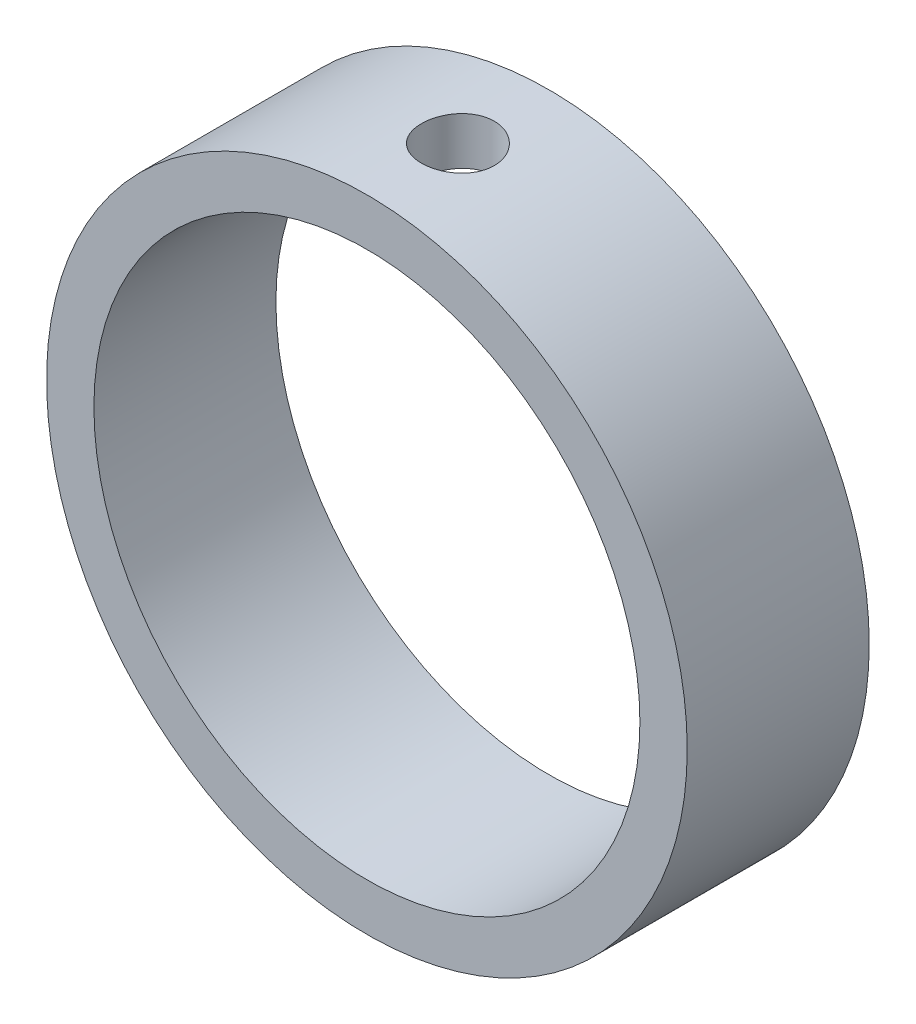
ISO-10303-21;
HEADER;
FILE_DESCRIPTION(('STEP AP214'),'2;1');
FILE_NAME('part.step','',(''),(''),'','','');
FILE_SCHEMA(('AUTOMOTIVE_DESIGN { 1 0 10303 214 1 1 1 1 }'));
ENDSEC;
DATA;
#1=APPLICATION_CONTEXT('core data for automotive mechanical design processes');
#2=APPLICATION_PROTOCOL_DEFINITION('international standard','automotive_design',2000,#1);
#3=PRODUCT_CONTEXT('',#1,'mechanical');
#4=PRODUCT('Part','Part','',(#3));
#5=PRODUCT_RELATED_PRODUCT_CATEGORY('part','',(#4));
#6=PRODUCT_DEFINITION_FORMATION('','',#4);
#7=PRODUCT_DEFINITION_CONTEXT('part definition',#1,'design');
#8=PRODUCT_DEFINITION('design','',#6,#7);
#9=PRODUCT_DEFINITION_SHAPE('','',#8);
#10=(LENGTH_UNIT() NAMED_UNIT(*) SI_UNIT(.MILLI.,.METRE.));
#11=(NAMED_UNIT(*) PLANE_ANGLE_UNIT() SI_UNIT($,.RADIAN.));
#12=(NAMED_UNIT(*) SI_UNIT($,.STERADIAN.) SOLID_ANGLE_UNIT());
#13=UNCERTAINTY_MEASURE_WITH_UNIT(LENGTH_MEASURE(1.E-05),#10,'distance_accuracy_value','');
#14=(GEOMETRIC_REPRESENTATION_CONTEXT(3) GLOBAL_UNCERTAINTY_ASSIGNED_CONTEXT((#13)) GLOBAL_UNIT_ASSIGNED_CONTEXT((#10,
#11,#12)) REPRESENTATION_CONTEXT('',''));
#15=CARTESIAN_POINT('',(0.,0.,0.));
#16=DIRECTION('',(0.,0.,1.));
#17=DIRECTION('',(1.,0.,0.));
#18=AXIS2_PLACEMENT_3D('',#15,#16,#17);
#19=CARTESIAN_POINT('',(0.,0.,25.));
#20=DIRECTION('',(0.,0.,-1.));
#21=DIRECTION('',(-1.,0.,0.));
#22=AXIS2_PLACEMENT_3D('',#19,#20,#21);
#23=CYLINDRICAL_SURFACE('',#22,44.);
#24=CARTESIAN_POINT('',(0.,0.,25.));
#25=DIRECTION('',(0.,0.,1.));
#26=DIRECTION('',(1.,0.,0.));
#27=AXIS2_PLACEMENT_3D('',#24,#25,#26);
#28=CIRCLE('',#27,44.);
#29=CARTESIAN_POINT('',(44.,0.,25.));
#30=VERTEX_POINT('',#29);
#31=EDGE_CURVE('E10',#30,#30,#28,.T.);
#32=ORIENTED_EDGE('',*,*,#31,.F.);
#33=EDGE_LOOP('',(#32));
#34=FACE_BOUND('',#33,.T.);
#35=CARTESIAN_POINT('',(0.,0.,0.));
#36=DIRECTION('',(0.,0.,1.));
#37=DIRECTION('',(1.,0.,0.));
#38=AXIS2_PLACEMENT_3D('',#35,#36,#37);
#39=CIRCLE('',#38,44.);
#40=CARTESIAN_POINT('',(44.,0.,0.));
#41=VERTEX_POINT('',#40);
#42=EDGE_CURVE('E44',#41,#41,#39,.T.);
#43=ORIENTED_EDGE('',*,*,#42,.T.);
#44=EDGE_LOOP('',(#43));
#45=FACE_BOUND('',#44,.T.);
#46=CARTESIAN_POINT('',(0.,44.,7.5));
#47=CARTESIAN_POINT('',(-0.13999141125662,44.0000004581266,7.49999850614793));
#48=CARTESIAN_POINT('',(-0.279960479471429,43.9993305682535,7.50588143545811));
#49=CARTESIAN_POINT('',(-0.558943697753561,43.9966707032609,7.52936870419389));
#50=CARTESIAN_POINT('',(-0.69795761767849,43.994680420536,7.54697577493643));
#51=CARTESIAN_POINT('',(-0.974097994966257,43.9894330890567,7.5938036654042));
#52=CARTESIAN_POINT('',(-1.11122291462584,43.9861750649085,7.6230334279487));
#53=CARTESIAN_POINT('',(-1.38255453793291,43.9784830315098,7.69290368403062));
#54=CARTESIAN_POINT('',(-1.51676015370132,43.974048591724,7.73354835542571));
#55=CARTESIAN_POINT('',(-1.78111605427153,43.9641343126888,7.82590014923754));
#56=CARTESIAN_POINT('',(-1.91127031016283,43.9586555371905,7.87759602145357));
#57=CARTESIAN_POINT('',(-2.16679914436993,43.9468013442121,7.99172221174183));
#58=CARTESIAN_POINT('',(-2.29217194168833,43.9404255966951,8.05415648285205));
#59=CARTESIAN_POINT('',(-2.53714233280952,43.9269615480419,8.18926178429677));
#60=CARTESIAN_POINT('',(-2.65674311924509,43.9198736476588,8.26192706642542));
#61=CARTESIAN_POINT('',(-2.8894567777011,43.9051778280313,8.41703533566126));
#62=CARTESIAN_POINT('',(-3.00256722707446,43.8975697169005,8.49948193906643));
#63=CARTESIAN_POINT('',(-3.22187590285528,43.8820196413832,8.67387714718923));
#64=CARTESIAN_POINT('',(-3.32804682933456,43.8740765395891,8.76585998271369));
#65=CARTESIAN_POINT('',(-3.53231046879683,43.8581039744426,8.95846150976974));
#66=CARTESIAN_POINT('',(-3.6304001804294,43.8500744802449,9.05908338174519));
#67=CARTESIAN_POINT('',(-3.81774090521255,43.8341612434348,9.26819645549704));
#68=CARTESIAN_POINT('',(-3.90699473084515,43.8262774550979,9.37668513407915));
#69=CARTESIAN_POINT('',(-4.07610263735484,43.8108730942795,9.60084391017931));
#70=CARTESIAN_POINT('',(-4.15595323797214,43.8033526568825,9.71651664256973));
#71=CARTESIAN_POINT('',(-4.30583015580509,43.7888742918897,9.95448514910312));
#72=CARTESIAN_POINT('',(-4.37583242097246,43.7819177584459,10.0767961604914));
#73=CARTESIAN_POINT('',(-4.50530495566809,43.768784117096,10.326966367124));
#74=CARTESIAN_POINT('',(-4.56477131067908,43.7626072991297,10.4548276026265));
#75=CARTESIAN_POINT('',(-4.67268674404324,43.7512165733361,10.7151112099878));
#76=CARTESIAN_POINT('',(-4.72114016038494,43.746002286521,10.8475317621851));
#77=CARTESIAN_POINT('',(-4.80671808573633,43.7366812412697,11.1160365709211));
#78=CARTESIAN_POINT('',(-4.84383842905211,43.7325748901413,11.2521221546616));
#79=CARTESIAN_POINT('',(-4.93742616118866,43.7221451764026,11.6631340934795));
#80=CARTESIAN_POINT('',(-4.97670993890178,43.7176467517109,11.942242539906));
#81=CARTESIAN_POINT('',(-5.00788886178928,43.7140853994659,12.5029721127435));
#82=CARTESIAN_POINT('',(-4.99978559368062,43.7150222899155,12.7845931547068));
#83=CARTESIAN_POINT('',(-4.93664828279359,43.7221967989103,13.3411439314998));
#84=CARTESIAN_POINT('',(-4.88183500734194,43.7284094817919,13.6160988956415));
#85=CARTESIAN_POINT('',(-4.72716103590393,43.7453991420421,14.1528711369955));
#86=CARTESIAN_POINT('',(-4.62729957288187,43.7561761971282,14.4146881904243));
#87=CARTESIAN_POINT('',(-4.38512792762072,43.781108146679,14.9184574270799));
#88=CARTESIAN_POINT('',(-4.24272081756643,43.7952707392153,15.160362624386));
#89=CARTESIAN_POINT('',(-3.91956858948055,43.8253719866508,15.6169232120794));
#90=CARTESIAN_POINT('',(-3.73882202150306,43.84131070871,15.8315775713863));
#91=CARTESIAN_POINT('',(-3.34289348478621,43.8732793302228,16.2288266651161));
#92=CARTESIAN_POINT('',(-3.12752099291229,43.8893092312201,16.411231564252));
#93=CARTESIAN_POINT('',(-2.66911282761631,43.9195686592559,16.7373288209149));
#94=CARTESIAN_POINT('',(-2.42607710778434,43.933798183274,16.8810211134934));
#95=CARTESIAN_POINT('',(-1.91910216520873,43.9588603102042,17.1256107257947));
#96=CARTESIAN_POINT('',(-1.65515768724329,43.9696920557017,17.2264972459268));
#97=CARTESIAN_POINT('',(-1.11392482077588,43.9867300070378,17.3824663852006));
#98=CARTESIAN_POINT('',(-0.836636948486711,43.9929363916638,17.4375507747741));
#99=CARTESIAN_POINT('',(-0.278231124816663,44.0000012325122,17.5001084860995));
#100=CARTESIAN_POINT('',(0.00285714890419533,44.0008890864601,17.5078435325244));
#101=CARTESIAN_POINT('',(0.562325951365314,43.997295940638,17.4761720956309));
#102=CARTESIAN_POINT('',(0.840706527482438,43.9928150349766,17.4367664386395));
#103=CARTESIAN_POINT('',(1.38609358678543,43.9790063712738,17.3121494905095));
#104=CARTESIAN_POINT('',(1.65312869699059,43.969691705935,17.22706191183));
#105=CARTESIAN_POINT('',(2.16913748960813,43.9472593400305,17.0136242747638));
#106=CARTESIAN_POINT('',(2.41811065710194,43.9341415310961,16.8852729835829));
#107=CARTESIAN_POINT('',(2.89210403028099,43.9054942929266,16.5883107575816));
#108=CARTESIAN_POINT('',(3.11701674246998,43.8899547457658,16.4195292412079));
#109=CARTESIAN_POINT('',(3.53541368185469,43.8582370845888,16.0467395357457));
#110=CARTESIAN_POINT('',(3.72889688408027,43.8420589497686,15.8427301982651));
#111=CARTESIAN_POINT('',(4.07986196811242,43.8107977446684,15.4041319675801));
#112=CARTESIAN_POINT('',(4.23717117756978,43.7957201519302,15.1694044694563));
#113=CARTESIAN_POINT('',(4.51013138976851,43.7684545879784,14.676696829135));
#114=CARTESIAN_POINT('',(4.62578310259632,43.7562665675108,14.4187170833851));
#115=CARTESIAN_POINT('',(4.81186644373251,43.7361946556692,13.8874546026046));
#116=CARTESIAN_POINT('',(4.88239800493097,43.7283012583321,13.6142071536856));
#117=CARTESIAN_POINT('',(4.97654257681038,43.7176894488162,13.0594984999998));
#118=CARTESIAN_POINT('',(5.00015736357087,43.714970840741,12.7780376065703));
#119=CARTESIAN_POINT('',(4.99992022972581,43.7149936939285,12.3569604613044));
#120=CARTESIAN_POINT('',(4.99395320659471,43.7156784234056,12.2171127214404));
#121=CARTESIAN_POINT('',(4.97032803322491,43.718371576306,11.9384351484297));
#122=CARTESIAN_POINT('',(4.95267423052156,43.7203795074908,11.7996049561612));
#123=CARTESIAN_POINT('',(4.90579167748809,43.7256647144177,11.5238957294153));
#124=CARTESIAN_POINT('',(4.87655870152535,43.7289424535459,11.3870174261617));
#125=CARTESIAN_POINT('',(4.80674789491028,43.7366712089749,11.1162700624496));
#126=CARTESIAN_POINT('',(4.76617420128519,43.7411217973932,10.9823999238342));
#127=CARTESIAN_POINT('',(4.67396649723871,43.7510706748011,10.7185481528664));
#128=CARTESIAN_POINT('',(4.62233118663799,43.7565690869433,10.5885669796705));
#129=CARTESIAN_POINT('',(4.50839603837614,43.7684548796131,10.333465346954));
#130=CARTESIAN_POINT('',(4.44610008405933,43.774841936277,10.2083431377538));
#131=CARTESIAN_POINT('',(4.31124998997299,43.7883285168175,9.96373601746295));
#132=CARTESIAN_POINT('',(4.23869215531546,43.7954282970485,9.84425315763163));
#133=CARTESIAN_POINT('',(4.08387551741959,43.8101358375255,9.61184322351456));
#134=CARTESIAN_POINT('',(4.00162022154341,43.8177434136834,9.49891380090968));
#135=CARTESIAN_POINT('',(3.82745182870047,43.8333012524322,9.27970118430513));
#136=CARTESIAN_POINT('',(3.73548483164834,43.8412532657138,9.17346093435833));
#137=CARTESIAN_POINT('',(3.54297708219709,43.8572301429132,8.96913487956808));
#138=CARTESIAN_POINT('',(3.4424394601815,43.8652549792838,8.87104612305895));
#139=CARTESIAN_POINT('',(3.23340074957693,43.8811589502823,8.68360919044055));
#140=CARTESIAN_POINT('',(3.12489487290866,43.8890379936848,8.59426634617263));
#141=CARTESIAN_POINT('',(2.90077341497056,43.9044203143742,8.42504936693634));
#142=CARTESIAN_POINT('',(2.78516047440591,43.9119237293719,8.34517174697528));
#143=CARTESIAN_POINT('',(2.54717424585691,43.9263720566147,8.19514701341109));
#144=CARTESIAN_POINT('',(2.42477840851766,43.9333148908783,8.12503546213163));
#145=CARTESIAN_POINT('',(2.17451550917749,43.9464125521565,7.99540962443344));
#146=CARTESIAN_POINT('',(2.04665047412735,43.9525676677902,7.9358914534717));
#147=CARTESIAN_POINT('',(1.78641495302468,43.9639132078741,7.82789669055715));
#148=CARTESIAN_POINT('',(1.6540481644111,43.9691044024174,7.77941127730199));
#149=CARTESIAN_POINT('',(1.38570276254002,43.9783794404877,7.69378892948106));
#150=CARTESIAN_POINT('',(1.2497250268082,43.9824635504009,7.65664926463384));
#151=CARTESIAN_POINT('',(0.93016971484192,43.9905439518324,7.58373147874333));
#152=CARTESIAN_POINT('',(0.745556586672629,43.994075509304,7.55236345232762));
#153=CARTESIAN_POINT('',(0.373949013766013,43.998803220807,7.51049877009299));
#154=CARTESIAN_POINT('',(0.186954582643699,43.9999993881849,7.50000199499731));
#155=CARTESIAN_POINT('',(0.,44.,7.5));
#156=B_SPLINE_CURVE_WITH_KNOTS('',3,(#46,#47,#48,#49,#50,#51,#52,#53,#54,#55,#56,#57,#58,#59,
#60,#61,#62,#63,#64,#65,#66,#67,#68,#69,#70,#71,#72,#73,#74,#75,#76,#77,#78,#79,#80,#81,#82,#83,
#84,#85,#86,#87,#88,#89,#90,#91,#92,#93,#94,#95,#96,#97,#98,#99,#100,#101,#102,#103,#104,#105,
#106,#107,#108,#109,#110,#111,#112,#113,#114,#115,#116,#117,#118,#119,#120,#121,#122,#123,#124,
#125,#126,#127,#128,#129,#130,#131,#132,#133,#134,#135,#136,#137,#138,#139,#140,#141,#142,#143,
#144,#145,#146,#147,#148,#149,#150,#151,#152,#153,#154,#155),.UNSPECIFIED.,.T.,.F.,(4,2,2,2,2,2,
2,2,2,2,2,2,2,2,2,2,2,2,2,2,2,2,2,2,2,2,2,2,2,2,2,2,2,2,2,2,2,2,2,2,2,2,2,2,2,2,2,2,2,2,2,2,2,2,
4),(0.,0.419810686635586,0.839719208784399,1.25995144724957,1.68033769164167,2.10029800066975,
2.5204132383973,2.94029337295465,3.36032922997954,3.78192876830819,4.20368418871408,
4.62530492886575,5.04708122930201,5.46987036425217,5.89281625457319,6.3155952569767,
6.73852947354387,7.57982110733377,8.42108457131419,9.25839385210692,10.0957173903072,
10.934963263568,11.7742408816211,12.6183053324352,13.4623711993358,14.3066498915821,
15.1508959476327,15.990471167584,16.8300316708795,17.6673299222118,18.5046520342741,
19.3455711736353,20.1865177313068,21.0313987717906,21.8762654098977,22.7192542843803,
23.5622112461016,23.9817329615592,24.4010987006563,24.8206176217275,25.2399837040446,
25.6593991056043,26.0786620509965,26.4980763421643,26.9173394029445,27.3390656147619,
27.7606384475126,28.1824667071435,28.6041391684096,29.0273090733754,29.4503234827753,
29.8729984708284,30.2955716645922,30.8562202039863,31.4168655393309),.UNSPECIFIED.);
#157=CARTESIAN_POINT('',(0.,44.,7.5));
#158=VERTEX_POINT('',#157);
#159=EDGE_CURVE('E54',#158,#158,#156,.T.);
#160=ORIENTED_EDGE('',*,*,#159,.F.);
#161=EDGE_LOOP('',(#160));
#162=FACE_BOUND('',#161,.T.);
#163=ADVANCED_FACE('F31',(#34,#45,#162),#23,.T.);
#164=CARTESIAN_POINT('',(0.,0.,25.));
#165=DIRECTION('',(0.,0.,-1.));
#166=DIRECTION('',(-1.,0.,0.));
#167=AXIS2_PLACEMENT_3D('',#164,#165,#166);
#168=CYLINDRICAL_SURFACE('',#167,37.5);
#169=CARTESIAN_POINT('',(0.,0.,0.));
#170=DIRECTION('',(0.,0.,1.));
#171=DIRECTION('',(1.,0.,0.));
#172=AXIS2_PLACEMENT_3D('',#169,#170,#171);
#173=CIRCLE('',#172,37.5);
#174=CARTESIAN_POINT('',(37.5,0.,0.));
#175=VERTEX_POINT('',#174);
#176=EDGE_CURVE('E51',#175,#175,#173,.T.);
#177=ORIENTED_EDGE('',*,*,#176,.F.);
#178=EDGE_LOOP('',(#177));
#179=FACE_BOUND('',#178,.T.);
#180=CARTESIAN_POINT('',(0.,0.,25.));
#181=DIRECTION('',(0.,0.,1.));
#182=DIRECTION('',(1.,0.,0.));
#183=AXIS2_PLACEMENT_3D('',#180,#181,#182);
#184=CIRCLE('',#183,37.5);
#185=CARTESIAN_POINT('',(37.5,0.,25.));
#186=VERTEX_POINT('',#185);
#187=EDGE_CURVE('E49',#186,#186,#184,.T.);
#188=ORIENTED_EDGE('',*,*,#187,.T.);
#189=EDGE_LOOP('',(#188));
#190=FACE_BOUND('',#189,.T.);
#191=CARTESIAN_POINT('',(0.,37.5,7.5));
#192=CARTESIAN_POINT('',(-0.139809857161942,37.5000006035784,7.49999830351591));
#193=CARTESIAN_POINT('',(-0.279595172641455,37.4992166043786,7.50586608529861));
#194=CARTESIAN_POINT('',(-0.558209611683407,37.4961038038827,7.5292915606585));
#195=CARTESIAN_POINT('',(-0.697038516461322,37.4937746602546,7.54685184475364));
#196=CARTESIAN_POINT('',(-0.972801317522204,37.4876339352639,7.59355207104977));
#197=CARTESIAN_POINT('',(-1.10973376640755,37.483821279974,7.62270040227392));
#198=CARTESIAN_POINT('',(-1.3806814876246,37.4748195285748,7.6923715203234));
#199=CARTESIAN_POINT('',(-1.51469567167939,37.4696299281757,7.73289847475035));
#200=CARTESIAN_POINT('',(-1.77866517944389,37.4580270104952,7.82497388759628));
#201=CARTESIAN_POINT('',(-1.90862471015347,37.4516150142465,7.87651045520317));
#202=CARTESIAN_POINT('',(-2.16377442653378,37.4377404728693,7.99027733472649));
#203=CARTESIAN_POINT('',(-2.28896283462189,37.4302775409615,8.05251158561486));
#204=CARTESIAN_POINT('',(-2.53358466180885,37.4145154352324,8.18717816587533));
#205=CARTESIAN_POINT('',(-2.65302114333451,37.4062167138416,8.25960498614237));
#206=CARTESIAN_POINT('',(-2.88543153803738,37.3890073442538,8.41419888963501));
#207=CARTESIAN_POINT('',(-2.99840303368927,37.3800964698529,8.49636958166453));
#208=CARTESIAN_POINT('',(-3.21762873248845,37.3618659704914,8.67030739376688));
#209=CARTESIAN_POINT('',(-3.32384495567241,37.3525444611663,8.76212218815629));
#210=CARTESIAN_POINT('',(-3.52821633618743,37.3337946917017,8.95438578841241));
#211=CARTESIAN_POINT('',(-3.62636849713842,37.3243663933499,9.05483777549905));
#212=CARTESIAN_POINT('',(-3.81385543391411,37.3056749300062,9.26361540824268));
#213=CARTESIAN_POINT('',(-3.90319297468566,37.2964117139836,9.37193856625928));
#214=CARTESIAN_POINT('',(-4.07249114449239,37.2783056025132,9.59577639123781));
#215=CARTESIAN_POINT('',(-4.15244830229266,37.2694628633793,9.71129369635665));
#216=CARTESIAN_POINT('',(-4.30264336164983,37.2524226807134,9.94909721822149));
#217=CARTESIAN_POINT('',(-4.37284634478348,37.2442275986426,10.071405665573));
#218=CARTESIAN_POINT('',(-4.50271791105838,37.228749776666,10.3216040863629));
#219=CARTESIAN_POINT('',(-4.56238257237183,37.2214673767056,10.4494961157369));
#220=CARTESIAN_POINT('',(-4.67068653301889,37.2080323864431,10.7098743906196));
#221=CARTESIAN_POINT('',(-4.71933027474225,37.2018793411033,10.8423587600973));
#222=CARTESIAN_POINT('',(-4.80527579014029,37.1908748711901,11.1110235522366));
#223=CARTESIAN_POINT('',(-4.84257340269532,37.1860239242294,11.2472053109956));
#224=CARTESIAN_POINT('',(-4.93656175023383,37.1737079392626,11.6581057876112));
#225=CARTESIAN_POINT('',(-4.97611579552634,37.1683811858736,11.9370320625756));
#226=CARTESIAN_POINT('',(-5.00788132323698,37.164113738729,12.4974579708333));
#227=CARTESIAN_POINT('',(-5.00009496347089,37.1651727539045,12.7789574862521));
#228=CARTESIAN_POINT('',(-4.93768985074461,37.1735145714914,13.3347915398211));
#229=CARTESIAN_POINT('',(-4.88337642057535,37.1807567970259,13.6091608004894));
#230=CARTESIAN_POINT('',(-4.72991913360118,37.2005886378971,14.144845116194));
#231=CARTESIAN_POINT('',(-4.63077425464098,37.2131783751565,14.4061598734374));
#232=CARTESIAN_POINT('',(-4.39014795461964,37.2423315766249,14.9092732726757));
#233=CARTESIAN_POINT('',(-4.24853487441532,37.2589073661903,15.1510082097885));
#234=CARTESIAN_POINT('',(-3.92708490703945,37.2941558924048,15.6073979230028));
#235=CARTESIAN_POINT('',(-3.74724603230753,37.3128287380671,15.8220512900657));
#236=CARTESIAN_POINT('',(-3.35276223075558,37.3503474843885,16.2199574723122));
#237=CARTESIAN_POINT('',(-3.13785426223237,37.3691935894807,16.4029495909141));
#238=CARTESIAN_POINT('',(-2.68023543066727,37.4047980945058,16.7303051281627));
#239=CARTESIAN_POINT('',(-2.43752448753738,37.4215564884248,16.8746684355329));
#240=CARTESIAN_POINT('',(-1.93098054789413,37.4511098438437,17.120672790011));
#241=CARTESIAN_POINT('',(-1.66713894671185,37.4639031802894,17.2222963265636));
#242=CARTESIAN_POINT('',(-1.12592731123183,37.4840706475363,17.379723298483));
#243=CARTESIAN_POINT('',(-0.848557998988531,37.4914450672404,17.4355291765816));
#244=CARTESIAN_POINT('',(-0.290417258182222,37.4999060344292,17.4993960819446));
#245=CARTESIAN_POINT('',(-0.00968758622736226,37.5010398461927,17.5078160055617));
#246=CARTESIAN_POINT('',(0.549179042906564,37.4970197884964,17.4776208385791));
#247=CARTESIAN_POINT('',(0.827316062935107,37.4918660718566,17.4390068911489));
#248=CARTESIAN_POINT('',(1.37203428935979,37.4758793838114,17.3161383709187));
#249=CARTESIAN_POINT('',(1.63865504284749,37.4650678570428,17.2320560955814));
#250=CARTESIAN_POINT('',(2.15401274541647,37.4389752318875,17.0208175687698));
#251=CARTESIAN_POINT('',(2.40274901169671,37.4236939629659,16.8936596737948));
#252=CARTESIAN_POINT('',(2.87687220241664,37.3902459322604,16.5990196725704));
#253=CARTESIAN_POINT('',(3.10211455798004,37.3720628686903,16.4313068159697));
#254=CARTESIAN_POINT('',(3.52138234549023,37.3348932252024,16.0606414466759));
#255=CARTESIAN_POINT('',(3.71540635947636,37.3159066088361,15.8576873341685));
#256=CARTESIAN_POINT('',(4.06801381819454,37.2791225338362,15.4207180085332));
#257=CARTESIAN_POINT('',(4.22635849949014,37.261333614562,15.1865093216696));
#258=CARTESIAN_POINT('',(4.50145846771057,37.2291034298635,14.694598235855));
#259=CARTESIAN_POINT('',(4.61821468334676,37.214662089687,14.4368963616912));
#260=CARTESIAN_POINT('',(4.80644706354516,37.190819904382,13.9061189480131));
#261=CARTESIAN_POINT('',(4.87805501107639,37.1814044018275,13.6330907091326));
#262=CARTESIAN_POINT('',(4.97436238892195,37.168645171367,13.0785959999215));
#263=CARTESIAN_POINT('',(4.99906432832376,37.1653011186887,12.7971299817613));
#264=CARTESIAN_POINT('',(5.00042688871785,37.1651127634092,12.3762191338547));
#265=CARTESIAN_POINT('',(4.99501216960199,37.165843851816,12.2366101259283));
#266=CARTESIAN_POINT('',(4.97253184958063,37.1688591219892,11.9583642519712));
#267=CARTESIAN_POINT('',(4.95547059498609,37.1711427243797,11.8197270427717));
#268=CARTESIAN_POINT('',(4.90981100429212,37.1772010305187,11.5443576239738));
#269=CARTESIAN_POINT('',(4.88120848504186,37.1809762749051,11.4076261237126));
#270=CARTESIAN_POINT('',(4.81269401595573,37.1899068333592,11.1371235211914));
#271=CARTESIAN_POINT('',(4.77278617180068,37.1950616463805,11.0033513631854));
#272=CARTESIAN_POINT('',(4.68195430652271,37.2066042119064,10.7396741991623));
#273=CARTESIAN_POINT('',(4.63103154328916,37.212991823618,10.6097687534971));
#274=CARTESIAN_POINT('',(4.51855658876872,37.2268163237538,10.3547589053333));
#275=CARTESIAN_POINT('',(4.45700824672089,37.2342528320251,10.2296527842136));
#276=CARTESIAN_POINT('',(4.32368363022056,37.2499699958554,9.98501021981246));
#277=CARTESIAN_POINT('',(4.2519035605378,37.2582509643222,9.86547586518365));
#278=CARTESIAN_POINT('',(4.09866580761583,37.2754192205796,9.63288881157443));
#279=CARTESIAN_POINT('',(4.01721159158497,37.2843062906605,9.5198338118052));
#280=CARTESIAN_POINT('',(3.84448451679711,37.3025138234237,9.30005813682933));
#281=CARTESIAN_POINT('',(3.75313857242222,37.3118371759042,9.19339513239644));
#282=CARTESIAN_POINT('',(3.56184184352335,37.330584150837,8.9881694520011));
#283=CARTESIAN_POINT('',(3.46189418245564,37.3400077358127,8.88960386090452));
#284=CARTESIAN_POINT('',(3.25399690729603,37.3586991263206,8.701158197344));
#285=CARTESIAN_POINT('',(3.14604250986812,37.367966834608,8.61128339194338));
#286=CARTESIAN_POINT('',(2.92297556799255,37.3860766652253,8.44094839470461));
#287=CARTESIAN_POINT('',(2.80786568247649,37.394918943501,8.36048473739671));
#288=CARTESIAN_POINT('',(2.57069345067363,37.4119731315671,8.20914741292052));
#289=CARTESIAN_POINT('',(2.44860094515717,37.4201818802072,8.13832064099265));
#290=CARTESIAN_POINT('',(2.19886737795079,37.4356865483206,8.00724328505459));
#291=CARTESIAN_POINT('',(2.07122837464114,37.4429828025999,7.94698881864117));
#292=CARTESIAN_POINT('',(1.81135973412983,37.4564531746305,7.8375074189917));
#293=CARTESIAN_POINT('',(1.67913369918061,37.462628150195,7.78827204904046));
#294=CARTESIAN_POINT('',(1.41098911378824,37.473685750318,7.70114747454273));
#295=CARTESIAN_POINT('',(1.27507142850612,37.4785686748438,7.66325563617175));
#296=CARTESIAN_POINT('',(0.951549337616046,37.4883875197009,7.58765887234898));
#297=CARTESIAN_POINT('',(0.762768081383293,37.4927236192826,7.55482151750508));
#298=CARTESIAN_POINT('',(0.382642552902597,37.4985294338594,7.51099333831295));
#299=CARTESIAN_POINT('',(0.191298303278014,37.4999991741389,7.50000232125641));
#300=CARTESIAN_POINT('',(0.,37.5,7.5));
#301=B_SPLINE_CURVE_WITH_KNOTS('',3,(#191,#192,#193,#194,#195,#196,#197,#198,#199,#200,#201,
#202,#203,#204,#205,#206,#207,#208,#209,#210,#211,#212,#213,#214,#215,#216,#217,#218,#219,#220,
#221,#222,#223,#224,#225,#226,#227,#228,#229,#230,#231,#232,#233,#234,#235,#236,#237,#238,#239,
#240,#241,#242,#243,#244,#245,#246,#247,#248,#249,#250,#251,#252,#253,#254,#255,#256,#257,#258,
#259,#260,#261,#262,#263,#264,#265,#266,#267,#268,#269,#270,#271,#272,#273,#274,#275,#276,#277,
#278,#279,#280,#281,#282,#283,#284,#285,#286,#287,#288,#289,#290,#291,#292,#293,#294,#295,#296,
#297,#298,#299,#300),.UNSPECIFIED.,.T.,.F.,(4,2,2,2,2,2,2,2,2,2,2,2,2,2,2,2,2,2,2,2,2,2,2,2,2,2,
2,2,2,2,2,2,2,2,2,2,2,2,2,2,2,2,2,2,2,2,2,2,2,2,2,2,2,2,4),(0.,0.419262120559973,
0.838617161143731,1.25827634305797,1.67808943278332,2.09745137984392,2.51696807136684,
2.93625887795984,3.35570546372761,3.77733292157985,4.19911634246741,4.6207670359958,
5.04257327353929,5.46585261350654,5.88928914614609,6.31255469213693,6.73597528141106,
7.57687073511491,8.41772786037895,9.25310896470703,10.0885091166522,10.9265264157034,
11.7645872983509,12.6092504493772,13.4539160335633,14.2989273423194,15.1438935970495,
15.9824514620575,16.8209889461179,17.6563709221675,18.4917847748446,19.332068706503,
20.172390793725,21.0181794506422,21.8639492190821,22.7072387056423,23.5504830818468,
23.9692230560844,24.3878068482622,24.806542493317,25.2251262634093,25.6436622569952,
26.0620469480099,26.4805872352611,26.8989779680289,27.3207035244164,27.7422765847367,
28.1641035594343,28.5857747123536,29.0094295472959,29.4329284789613,29.85610204303,
30.2791772752092,30.8528481265814,31.4265139175347),.UNSPECIFIED.);
#302=CARTESIAN_POINT('',(0.,37.5,7.5));
#303=VERTEX_POINT('',#302);
#304=EDGE_CURVE('E35',#303,#303,#301,.T.);
#305=ORIENTED_EDGE('',*,*,#304,.T.);
#306=EDGE_LOOP('',(#305));
#307=FACE_BOUND('',#306,.T.);
#308=ADVANCED_FACE('F66',(#179,#190,#307),#168,.F.);
#309=CARTESIAN_POINT('',(0.,0.,25.));
#310=DIRECTION('',(0.,0.,1.));
#311=DIRECTION('',(1.,0.,0.));
#312=AXIS2_PLACEMENT_3D('',#309,#310,#311);
#313=PLANE('',#312);
#314=ORIENTED_EDGE('',*,*,#31,.T.);
#315=EDGE_LOOP('',(#314));
#316=FACE_BOUND('',#315,.T.);
#317=ORIENTED_EDGE('',*,*,#187,.F.);
#318=EDGE_LOOP('',(#317));
#319=FACE_BOUND('',#318,.T.);
#320=ADVANCED_FACE('F71',(#316,#319),#313,.T.);
#321=CARTESIAN_POINT('',(0.,0.,0.));
#322=DIRECTION('',(0.,0.,1.));
#323=DIRECTION('',(1.,0.,0.));
#324=AXIS2_PLACEMENT_3D('',#321,#322,#323);
#325=PLANE('',#324);
#326=ORIENTED_EDGE('',*,*,#42,.F.);
#327=EDGE_LOOP('',(#326));
#328=FACE_BOUND('',#327,.T.);
#329=ORIENTED_EDGE('',*,*,#176,.T.);
#330=EDGE_LOOP('',(#329));
#331=FACE_BOUND('',#330,.T.);
#332=ADVANCED_FACE('F64',(#328,#331),#325,.F.);
#333=CARTESIAN_POINT('',(0.,70.,12.5));
#334=DIRECTION('',(0.,-1.,0.));
#335=DIRECTION('',(0.,0.,-1.));
#336=AXIS2_PLACEMENT_3D('',#333,#334,#335);
#337=CYLINDRICAL_SURFACE('',#336,5.);
#338=ORIENTED_EDGE('',*,*,#304,.F.);
#339=EDGE_LOOP('',(#338));
#340=FACE_BOUND('',#339,.T.);
#341=ORIENTED_EDGE('',*,*,#159,.T.);
#342=EDGE_LOOP('',(#341));
#343=FACE_BOUND('',#342,.T.);
#344=ADVANCED_FACE('F61',(#340,#343),#337,.F.);
#345=CLOSED_SHELL('',(#163,#308,#320,#332,#344));
#346=MANIFOLD_SOLID_BREP('B2',#345);
#347=ADVANCED_BREP_SHAPE_REPRESENTATION('',(#18,#346),#14);
#348=SHAPE_DEFINITION_REPRESENTATION(#9,#347);
ENDSEC;
END-ISO-10303-21;
